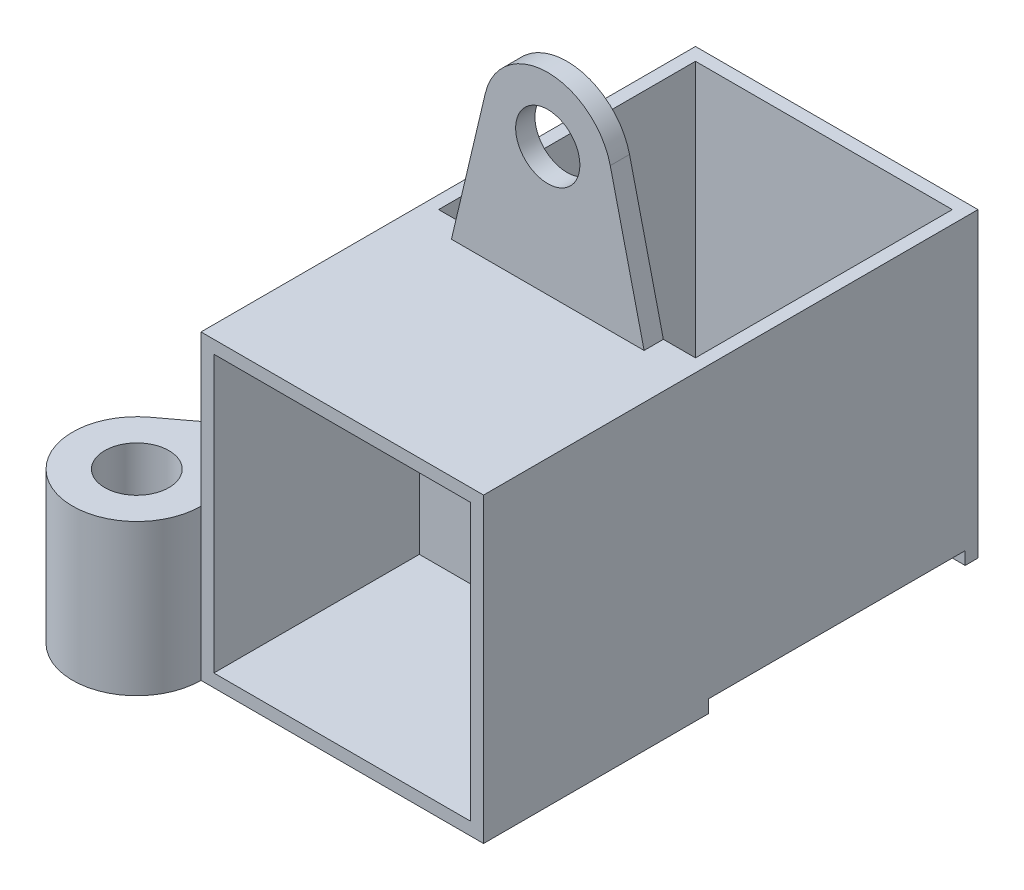
ISO-10303-21;
HEADER;
FILE_DESCRIPTION(('STEP AP214'),'2;1');
FILE_NAME('part.step','',(''),(''),'','','');
FILE_SCHEMA(('AUTOMOTIVE_DESIGN { 1 0 10303 214 1 1 1 1 }'));
ENDSEC;
DATA;
#1=APPLICATION_CONTEXT('core data for automotive mechanical design processes');
#2=APPLICATION_PROTOCOL_DEFINITION('international standard','automotive_design',2000,#1);
#3=PRODUCT_CONTEXT('',#1,'mechanical');
#4=PRODUCT('Part','Part','',(#3));
#5=PRODUCT_RELATED_PRODUCT_CATEGORY('part','',(#4));
#6=PRODUCT_DEFINITION_FORMATION('','',#4);
#7=PRODUCT_DEFINITION_CONTEXT('part definition',#1,'design');
#8=PRODUCT_DEFINITION('design','',#6,#7);
#9=PRODUCT_DEFINITION_SHAPE('','',#8);
#10=(LENGTH_UNIT() NAMED_UNIT(*) SI_UNIT(.MILLI.,.METRE.));
#11=(NAMED_UNIT(*) PLANE_ANGLE_UNIT() SI_UNIT($,.RADIAN.));
#12=(NAMED_UNIT(*) SI_UNIT($,.STERADIAN.) SOLID_ANGLE_UNIT());
#13=UNCERTAINTY_MEASURE_WITH_UNIT(LENGTH_MEASURE(1.E-05),#10,'distance_accuracy_value','');
#14=(GEOMETRIC_REPRESENTATION_CONTEXT(3) GLOBAL_UNCERTAINTY_ASSIGNED_CONTEXT((#13)) GLOBAL_UNIT_ASSIGNED_CONTEXT((#10,
#11,#12)) REPRESENTATION_CONTEXT('',''));
#15=CARTESIAN_POINT('',(0.,0.,0.));
#16=DIRECTION('',(0.,0.,1.));
#17=DIRECTION('',(1.,0.,0.));
#18=AXIS2_PLACEMENT_3D('',#15,#16,#17);
#19=CARTESIAN_POINT('',(-32.,-43.5,32.));
#20=DIRECTION('',(0.,-1.,0.));
#21=DIRECTION('',(0.,0.,-1.));
#22=AXIS2_PLACEMENT_3D('',#19,#20,#21);
#23=CYLINDRICAL_SURFACE('',#22,10.);
#24=CARTESIAN_POINT('',(-32.,-67.,32.));
#25=DIRECTION('',(0.,1.,0.));
#26=DIRECTION('',(0.,0.,1.));
#27=AXIS2_PLACEMENT_3D('',#24,#25,#26);
#28=CIRCLE('',#27,10.);
#29=CARTESIAN_POINT('',(-38.,-67.,24.));
#30=VERTEX_POINT('',#29);
#31=CARTESIAN_POINT('',(-22.,-67.,32.));
#32=VERTEX_POINT('',#31);
#33=EDGE_CURVE('E129',#30,#32,#28,.T.);
#34=ORIENTED_EDGE('',*,*,#33,.T.);
#35=DIRECTION('',(0.,-1.,0.));
#36=VECTOR('',#35,1.);
#37=CARTESIAN_POINT('',(-22.,-43.5,32.));
#38=LINE('',#37,#36);
#39=CARTESIAN_POINT('',(-22.,-43.5,32.));
#40=VERTEX_POINT('',#39);
#41=EDGE_CURVE('E91',#40,#32,#38,.T.);
#42=ORIENTED_EDGE('',*,*,#41,.F.);
#43=CARTESIAN_POINT('',(-32.,-43.5,32.));
#44=DIRECTION('',(0.,1.,0.));
#45=DIRECTION('',(0.,0.,1.));
#46=AXIS2_PLACEMENT_3D('',#43,#44,#45);
#47=CIRCLE('',#46,10.);
#48=CARTESIAN_POINT('',(-38.,-43.5,24.));
#49=VERTEX_POINT('',#48);
#50=EDGE_CURVE('E122',#49,#40,#47,.T.);
#51=ORIENTED_EDGE('',*,*,#50,.F.);
#52=DIRECTION('',(0.,-1.,0.));
#53=VECTOR('',#52,1.);
#54=CARTESIAN_POINT('',(-38.,-43.5,24.));
#55=LINE('',#54,#53);
#56=EDGE_CURVE('E13',#49,#30,#55,.T.);
#57=ORIENTED_EDGE('',*,*,#56,.T.);
#58=EDGE_LOOP('',(#34,#42,#51,#57));
#59=FACE_BOUND('',#58,.T.);
#60=ADVANCED_FACE('F81',(#59),#23,.T.);
#61=CARTESIAN_POINT('',(-38.6618069237234,-43.5,24.4963551927926));
#62=DIRECTION('',(-0.6,0.,-0.8));
#63=DIRECTION('',(-0.8,0.,0.6));
#64=AXIS2_PLACEMENT_3D('',#61,#62,#63);
#65=PLANE('',#64);
#66=DIRECTION('',(0.8,0.,-0.6));
#67=VECTOR('',#66,1.);
#68=CARTESIAN_POINT('',(-38.6618069237234,-67.,24.4963551927926));
#69=LINE('',#68,#67);
#70=CARTESIAN_POINT('',(-22.,-67.,12.));
#71=VERTEX_POINT('',#70);
#72=EDGE_CURVE('E137',#30,#71,#69,.T.);
#73=ORIENTED_EDGE('',*,*,#72,.F.);
#74=ORIENTED_EDGE('',*,*,#56,.F.);
#75=DIRECTION('',(0.8,0.,-0.6));
#76=VECTOR('',#75,1.);
#77=CARTESIAN_POINT('',(-38.6618069237234,-43.5,24.4963551927926));
#78=LINE('',#77,#76);
#79=CARTESIAN_POINT('',(-22.,-43.5,12.));
#80=VERTEX_POINT('',#79);
#81=EDGE_CURVE('E127',#49,#80,#78,.T.);
#82=ORIENTED_EDGE('',*,*,#81,.T.);
#83=DIRECTION('',(0.,-1.,0.));
#84=VECTOR('',#83,1.);
#85=CARTESIAN_POINT('',(-22.,-43.5,12.));
#86=LINE('',#85,#84);
#87=EDGE_CURVE('E85',#80,#71,#86,.T.);
#88=ORIENTED_EDGE('',*,*,#87,.T.);
#89=EDGE_LOOP('',(#73,#74,#82,#88));
#90=FACE_BOUND('',#89,.T.);
#91=ADVANCED_FACE('F83',(#90),#65,.T.);
#92=CARTESIAN_POINT('',(-22.,-43.5,76.0454310910905));
#93=DIRECTION('',(1.,0.,0.));
#94=DIRECTION('',(0.,0.,-1.));
#95=AXIS2_PLACEMENT_3D('',#92,#93,#94);
#96=PLANE('',#95);
#97=DIRECTION('',(0.,0.,1.));
#98=VECTOR('',#97,1.);
#99=CARTESIAN_POINT('',(-22.,-67.,76.0454310910905));
#100=LINE('',#99,#98);
#101=EDGE_CURVE('E120',#71,#32,#100,.T.);
#102=ORIENTED_EDGE('',*,*,#101,.F.);
#103=ORIENTED_EDGE('',*,*,#87,.F.);
#104=DIRECTION('',(0.,0.,1.));
#105=VECTOR('',#104,1.);
#106=CARTESIAN_POINT('',(-22.,-43.5,76.0454310910905));
#107=LINE('',#106,#105);
#108=EDGE_CURVE('E118',#80,#40,#107,.T.);
#109=ORIENTED_EDGE('',*,*,#108,.T.);
#110=ORIENTED_EDGE('',*,*,#41,.T.);
#111=EDGE_LOOP('',(#102,#103,#109,#110));
#112=FACE_BOUND('',#111,.T.);
#113=ADVANCED_FACE('F117',(#112),#96,.T.);
#114=CARTESIAN_POINT('',(-32.,-67.,32.));
#115=DIRECTION('',(0.,1.,0.));
#116=DIRECTION('',(0.,0.,1.));
#117=AXIS2_PLACEMENT_3D('',#114,#115,#116);
#118=PLANE('',#117);
#119=CARTESIAN_POINT('',(-32.,-67.,32.));
#120=DIRECTION('',(0.,1.,0.));
#121=DIRECTION('',(0.,0.,1.));
#122=AXIS2_PLACEMENT_3D('',#119,#120,#121);
#123=CIRCLE('',#122,5.);
#124=CARTESIAN_POINT('',(-32.,-67.,37.));
#125=VERTEX_POINT('',#124);
#126=EDGE_CURVE('E139',#125,#125,#123,.T.);
#127=ORIENTED_EDGE('',*,*,#126,.T.);
#128=EDGE_LOOP('',(#127));
#129=FACE_BOUND('',#128,.T.);
#130=ORIENTED_EDGE('',*,*,#101,.T.);
#131=ORIENTED_EDGE('',*,*,#33,.F.);
#132=ORIENTED_EDGE('',*,*,#72,.T.);
#133=EDGE_LOOP('',(#130,#131,#132));
#134=FACE_BOUND('',#133,.T.);
#135=ADVANCED_FACE('F141',(#129,#134),#118,.F.);
#136=CARTESIAN_POINT('',(-32.,-43.5,32.));
#137=DIRECTION('',(0.,1.,0.));
#138=DIRECTION('',(0.,0.,1.));
#139=AXIS2_PLACEMENT_3D('',#136,#137,#138);
#140=PLANE('',#139);
#141=CARTESIAN_POINT('',(-32.,-43.5,32.));
#142=DIRECTION('',(0.,1.,0.));
#143=DIRECTION('',(0.,0.,1.));
#144=AXIS2_PLACEMENT_3D('',#141,#142,#143);
#145=CIRCLE('',#144,5.);
#146=CARTESIAN_POINT('',(-32.,-43.5,37.));
#147=VERTEX_POINT('',#146);
#148=EDGE_CURVE('E133',#147,#147,#145,.T.);
#149=ORIENTED_EDGE('',*,*,#148,.F.);
#150=EDGE_LOOP('',(#149));
#151=FACE_BOUND('',#150,.T.);
#152=ORIENTED_EDGE('',*,*,#81,.F.);
#153=ORIENTED_EDGE('',*,*,#50,.T.);
#154=ORIENTED_EDGE('',*,*,#108,.F.);
#155=EDGE_LOOP('',(#152,#153,#154));
#156=FACE_BOUND('',#155,.T.);
#157=ADVANCED_FACE('F126',(#151,#156),#140,.T.);
#158=CARTESIAN_POINT('',(-32.,-67.,32.));
#159=DIRECTION('',(0.,1.,0.));
#160=DIRECTION('',(0.,0.,1.));
#161=AXIS2_PLACEMENT_3D('',#158,#159,#160);
#162=CYLINDRICAL_SURFACE('',#161,5.);
#163=ORIENTED_EDGE('',*,*,#126,.F.);
#164=EDGE_LOOP('',(#163));
#165=FACE_BOUND('',#164,.T.);
#166=ORIENTED_EDGE('',*,*,#148,.T.);
#167=EDGE_LOOP('',(#166));
#168=FACE_BOUND('',#167,.T.);
#169=ADVANCED_FACE('F157',(#165,#168),#162,.F.);
#170=CLOSED_SHELL('',(#60,#91,#113,#135,#157,#169));
#171=MANIFOLD_SOLID_BREP('B2',#170);
#172=CARTESIAN_POINT('',(0.,0.,0.));
#173=DIRECTION('',(0.,0.,1.));
#174=DIRECTION('',(1.,0.,0.));
#175=AXIS2_PLACEMENT_3D('',#172,#173,#174);
#176=PLANE('',#175);
#177=DIRECTION('',(0.,1.,0.));
#178=VECTOR('',#177,1.);
#179=CARTESIAN_POINT('',(20.,0.,0.));
#180=LINE('',#179,#178);
#181=CARTESIAN_POINT('',(20.,-65.,0.));
#182=VERTEX_POINT('',#181);
#183=CARTESIAN_POINT('',(20.,-22.,0.));
#184=VERTEX_POINT('',#183);
#185=EDGE_CURVE('E511',#182,#184,#180,.T.);
#186=ORIENTED_EDGE('',*,*,#185,.T.);
#187=DIRECTION('',(-1.,0.,0.));
#188=VECTOR('',#187,1.);
#189=CARTESIAN_POINT('',(0.,-22.,0.));
#190=LINE('',#189,#188);
#191=CARTESIAN_POINT('',(-20.,-22.,0.));
#192=VERTEX_POINT('',#191);
#193=EDGE_CURVE('E251',#184,#192,#190,.T.);
#194=ORIENTED_EDGE('',*,*,#193,.T.);
#195=DIRECTION('',(0.,1.,0.));
#196=VECTOR('',#195,1.);
#197=CARTESIAN_POINT('',(-20.,0.,0.));
#198=LINE('',#197,#196);
#199=CARTESIAN_POINT('',(-20.,-65.,0.));
#200=VERTEX_POINT('',#199);
#201=EDGE_CURVE('E507',#200,#192,#198,.T.);
#202=ORIENTED_EDGE('',*,*,#201,.F.);
#203=DIRECTION('',(1.,0.,0.));
#204=VECTOR('',#203,1.);
#205=CARTESIAN_POINT('',(0.,-65.,0.));
#206=LINE('',#205,#204);
#207=EDGE_CURVE('E509',#200,#182,#206,.T.);
#208=ORIENTED_EDGE('',*,*,#207,.T.);
#209=EDGE_LOOP('',(#186,#194,#202,#208));
#210=FACE_BOUND('',#209,.T.);
#211=ADVANCED_FACE('F233',(#210),#176,.T.);
#212=CARTESIAN_POINT('',(-20.,0.,32.));
#213=DIRECTION('',(-1.,0.,0.));
#214=DIRECTION('',(0.,0.,1.));
#215=AXIS2_PLACEMENT_3D('',#212,#213,#214);
#216=PLANE('',#215);
#217=DIRECTION('',(0.,0.,-1.));
#218=VECTOR('',#217,1.);
#219=CARTESIAN_POINT('',(-20.,-22.,32.));
#220=LINE('',#219,#218);
#221=CARTESIAN_POINT('',(-20.,-22.,32.));
#222=VERTEX_POINT('',#221);
#223=EDGE_CURVE('E258',#222,#192,#220,.T.);
#224=ORIENTED_EDGE('',*,*,#223,.F.);
#225=DIRECTION('',(0.,1.,0.));
#226=VECTOR('',#225,1.);
#227=CARTESIAN_POINT('',(-20.,0.,32.));
#228=LINE('',#227,#226);
#229=CARTESIAN_POINT('',(-20.,-65.,32.));
#230=VERTEX_POINT('',#229);
#231=EDGE_CURVE('E465',#230,#222,#228,.T.);
#232=ORIENTED_EDGE('',*,*,#231,.F.);
#233=DIRECTION('',(0.,0.,-1.));
#234=VECTOR('',#233,1.);
#235=CARTESIAN_POINT('',(-20.,-65.,32.));
#236=LINE('',#235,#234);
#237=EDGE_CURVE('E468',#230,#200,#236,.T.);
#238=ORIENTED_EDGE('',*,*,#237,.T.);
#239=ORIENTED_EDGE('',*,*,#201,.T.);
#240=EDGE_LOOP('',(#224,#232,#238,#239));
#241=FACE_BOUND('',#240,.T.);
#242=ADVANCED_FACE('F562',(#241),#216,.F.);
#243=CARTESIAN_POINT('',(20.,0.,-43.));
#244=DIRECTION('',(1.,0.,0.));
#245=DIRECTION('',(0.,0.,-1.));
#246=AXIS2_PLACEMENT_3D('',#243,#244,#245);
#247=PLANE('',#246);
#248=DIRECTION('',(0.,0.,1.));
#249=VECTOR('',#248,1.);
#250=CARTESIAN_POINT('',(20.,-22.,-43.));
#251=LINE('',#250,#249);
#252=CARTESIAN_POINT('',(20.,-22.,32.));
#253=VERTEX_POINT('',#252);
#254=EDGE_CURVE('E546',#184,#253,#251,.T.);
#255=ORIENTED_EDGE('',*,*,#254,.F.);
#256=ORIENTED_EDGE('',*,*,#185,.F.);
#257=DIRECTION('',(0.,0.,1.));
#258=VECTOR('',#257,1.);
#259=CARTESIAN_POINT('',(20.,-65.,-43.));
#260=LINE('',#259,#258);
#261=CARTESIAN_POINT('',(20.,-65.,32.));
#262=VERTEX_POINT('',#261);
#263=EDGE_CURVE('E450',#182,#262,#260,.T.);
#264=ORIENTED_EDGE('',*,*,#263,.T.);
#265=DIRECTION('',(0.,1.,0.));
#266=VECTOR('',#265,1.);
#267=CARTESIAN_POINT('',(20.,0.,32.));
#268=LINE('',#267,#266);
#269=EDGE_CURVE('E437',#262,#253,#268,.T.);
#270=ORIENTED_EDGE('',*,*,#269,.T.);
#271=EDGE_LOOP('',(#255,#256,#264,#270));
#272=FACE_BOUND('',#271,.T.);
#273=ADVANCED_FACE('F569',(#272),#247,.F.);
#274=CARTESIAN_POINT('',(0.,-65.,-3.));
#275=DIRECTION('',(0.,-1.,0.));
#276=DIRECTION('',(1.,0.,0.));
#277=AXIS2_PLACEMENT_3D('',#274,#275,#276);
#278=PLANE('',#277);
#279=DIRECTION('',(1.,0.,0.));
#280=VECTOR('',#279,1.);
#281=CARTESIAN_POINT('',(-4.51028103753967E-13,-64.9999999999999,-3.));
#282=LINE('',#281,#280);
#283=CARTESIAN_POINT('',(-22.,-65.,-3.));
#284=VERTEX_POINT('',#283);
#285=CARTESIAN_POINT('',(-20.,-65.,-3.));
#286=VERTEX_POINT('',#285);
#287=EDGE_CURVE('E244',#284,#286,#282,.T.);
#288=ORIENTED_EDGE('',*,*,#287,.F.);
#289=DIRECTION('',(0.,0.,-1.));
#290=VECTOR('',#289,1.);
#291=CARTESIAN_POINT('',(-22.,-65.,32.));
#292=LINE('',#291,#290);
#293=CARTESIAN_POINT('',(-22.,-65.,-43.));
#294=VERTEX_POINT('',#293);
#295=EDGE_CURVE('E467',#284,#294,#292,.T.);
#296=ORIENTED_EDGE('',*,*,#295,.T.);
#297=DIRECTION('',(-1.,0.,0.));
#298=VECTOR('',#297,1.);
#299=CARTESIAN_POINT('',(0.,-65.,-43.));
#300=LINE('',#299,#298);
#301=CARTESIAN_POINT('',(-20.,-65.,-43.));
#302=VERTEX_POINT('',#301);
#303=EDGE_CURVE('E449',#302,#294,#300,.T.);
#304=ORIENTED_EDGE('',*,*,#303,.F.);
#305=EDGE_CURVE('E471',#286,#302,#236,.T.);
#306=ORIENTED_EDGE('',*,*,#305,.F.);
#307=EDGE_LOOP('',(#288,#296,#304,#306));
#308=FACE_BOUND('',#307,.T.);
#309=ADVANCED_FACE('F571',(#308),#278,.T.);
#310=CARTESIAN_POINT('',(0.,0.,-3.));
#311=DIRECTION('',(0.,0.,1.));
#312=DIRECTION('',(1.,0.,0.));
#313=AXIS2_PLACEMENT_3D('',#310,#311,#312);
#314=CYLINDRICAL_SURFACE('',#313,10.);
#315=CARTESIAN_POINT('',(0.,0.,0.));
#316=DIRECTION('',(0.,0.,1.));
#317=DIRECTION('',(1.,0.,0.));
#318=AXIS2_PLACEMENT_3D('',#315,#316,#317);
#319=CIRCLE('',#318,10.);
#320=CARTESIAN_POINT('',(9.73212111192934,2.29909083394701,0.));
#321=VERTEX_POINT('',#320);
#322=CARTESIAN_POINT('',(-9.73212111192934,2.29909083394701,0.));
#323=VERTEX_POINT('',#322);
#324=EDGE_CURVE('E501',#321,#323,#319,.T.);
#325=ORIENTED_EDGE('',*,*,#324,.F.);
#326=DIRECTION('',(0.,0.,1.));
#327=VECTOR('',#326,1.);
#328=CARTESIAN_POINT('',(9.73212111192934,2.29909083394701,-3.));
#329=LINE('',#328,#327);
#330=CARTESIAN_POINT('',(9.73212111192934,2.29909083394701,-3.));
#331=VERTEX_POINT('',#330);
#332=EDGE_CURVE('E242',#331,#321,#329,.T.);
#333=ORIENTED_EDGE('',*,*,#332,.F.);
#334=CARTESIAN_POINT('',(0.,0.,-3.));
#335=DIRECTION('',(0.,0.,1.));
#336=DIRECTION('',(1.,0.,0.));
#337=AXIS2_PLACEMENT_3D('',#334,#335,#336);
#338=CIRCLE('',#337,10.);
#339=CARTESIAN_POINT('',(-9.73212111192934,2.29909083394701,-3.));
#340=VERTEX_POINT('',#339);
#341=EDGE_CURVE('E482',#331,#340,#338,.T.);
#342=ORIENTED_EDGE('',*,*,#341,.T.);
#343=DIRECTION('',(0.,0.,1.));
#344=VECTOR('',#343,1.);
#345=CARTESIAN_POINT('',(-9.73212111192934,2.29909083394701,-3.));
#346=LINE('',#345,#344);
#347=EDGE_CURVE('E237',#340,#323,#346,.T.);
#348=ORIENTED_EDGE('',*,*,#347,.T.);
#349=EDGE_LOOP('',(#325,#333,#342,#348));
#350=FACE_BOUND('',#349,.T.);
#351=ADVANCED_FACE('F524',(#350),#314,.T.);
#352=CARTESIAN_POINT('',(9.73212111192933,2.29909083394701,-3.));
#353=DIRECTION('',(-0.973212111192934,-0.229909083394701,0.));
#354=DIRECTION('',(0.229909083394701,-0.973212111192934,0.));
#355=AXIS2_PLACEMENT_3D('',#352,#353,#354);
#356=PLANE('',#355);
#357=DIRECTION('',(0.229909083394701,-0.973212111192934,0.));
#358=VECTOR('',#357,1.);
#359=CARTESIAN_POINT('',(9.73212111192933,2.29909083394701,0.));
#360=LINE('',#359,#358);
#361=CARTESIAN_POINT('',(15.,-20.,0.));
#362=VERTEX_POINT('',#361);
#363=EDGE_CURVE('E483',#321,#362,#360,.T.);
#364=ORIENTED_EDGE('',*,*,#363,.T.);
#365=DIRECTION('',(0.,0.,1.));
#366=VECTOR('',#365,1.);
#367=CARTESIAN_POINT('',(15.,-20.,-3.));
#368=LINE('',#367,#366);
#369=CARTESIAN_POINT('',(15.,-20.,-3.));
#370=VERTEX_POINT('',#369);
#371=EDGE_CURVE('E516',#370,#362,#368,.T.);
#372=ORIENTED_EDGE('',*,*,#371,.F.);
#373=DIRECTION('',(0.229909083394701,-0.973212111192934,0.));
#374=VECTOR('',#373,1.);
#375=CARTESIAN_POINT('',(9.73212111192933,2.29909083394701,-3.));
#376=LINE('',#375,#374);
#377=EDGE_CURVE('E496',#331,#370,#376,.T.);
#378=ORIENTED_EDGE('',*,*,#377,.F.);
#379=ORIENTED_EDGE('',*,*,#332,.T.);
#380=EDGE_LOOP('',(#364,#372,#378,#379));
#381=FACE_BOUND('',#380,.T.);
#382=ADVANCED_FACE('F536',(#381),#356,.F.);
#383=CARTESIAN_POINT('',(0.,-20.,-3.));
#384=DIRECTION('',(0.,-1.,0.));
#385=DIRECTION('',(1.,0.,0.));
#386=AXIS2_PLACEMENT_3D('',#383,#384,#385);
#387=PLANE('',#386);
#388=DIRECTION('',(1.,0.,0.));
#389=VECTOR('',#388,1.);
#390=CARTESIAN_POINT('',(0.,-20.,-3.));
#391=LINE('',#390,#389);
#392=CARTESIAN_POINT('',(-20.,-20.,-3.));
#393=VERTEX_POINT('',#392);
#394=CARTESIAN_POINT('',(-15.,-20.,-3.));
#395=VERTEX_POINT('',#394);
#396=EDGE_CURVE('E489',#393,#395,#391,.T.);
#397=ORIENTED_EDGE('',*,*,#396,.F.);
#398=DIRECTION('',(0.,0.,-1.));
#399=VECTOR('',#398,1.);
#400=CARTESIAN_POINT('',(-20.,-20.,32.));
#401=LINE('',#400,#399);
#402=CARTESIAN_POINT('',(-20.,-20.,-43.));
#403=VERTEX_POINT('',#402);
#404=EDGE_CURVE('E472',#393,#403,#401,.T.);
#405=ORIENTED_EDGE('',*,*,#404,.T.);
#406=DIRECTION('',(1.,0.,0.));
#407=VECTOR('',#406,1.);
#408=CARTESIAN_POINT('',(0.,-20.,-43.));
#409=LINE('',#408,#407);
#410=CARTESIAN_POINT('',(20.,-20.,-43.));
#411=VERTEX_POINT('',#410);
#412=EDGE_CURVE('E387',#403,#411,#409,.T.);
#413=ORIENTED_EDGE('',*,*,#412,.T.);
#414=DIRECTION('',(0.,0.,1.));
#415=VECTOR('',#414,1.);
#416=CARTESIAN_POINT('',(20.,-20.,-43.));
#417=LINE('',#416,#415);
#418=CARTESIAN_POINT('',(20.,-20.,-3.));
#419=VERTEX_POINT('',#418);
#420=EDGE_CURVE('E451',#411,#419,#417,.T.);
#421=ORIENTED_EDGE('',*,*,#420,.T.);
#422=EDGE_CURVE('E492',#370,#419,#391,.T.);
#423=ORIENTED_EDGE('',*,*,#422,.F.);
#424=ORIENTED_EDGE('',*,*,#371,.T.);
#425=DIRECTION('',(-1.,0.,0.));
#426=VECTOR('',#425,1.);
#427=CARTESIAN_POINT('',(0.,-20.,0.));
#428=LINE('',#427,#426);
#429=CARTESIAN_POINT('',(-15.,-20.,0.));
#430=VERTEX_POINT('',#429);
#431=EDGE_CURVE('E533',#362,#430,#428,.T.);
#432=ORIENTED_EDGE('',*,*,#431,.T.);
#433=DIRECTION('',(0.,0.,1.));
#434=VECTOR('',#433,1.);
#435=CARTESIAN_POINT('',(-15.,-20.,-3.));
#436=LINE('',#435,#434);
#437=EDGE_CURVE('E518',#395,#430,#436,.T.);
#438=ORIENTED_EDGE('',*,*,#437,.F.);
#439=EDGE_LOOP('',(#397,#405,#413,#421,#423,#424,#432,#438));
#440=FACE_BOUND('',#439,.T.);
#441=DIRECTION('',(1.,0.,0.));
#442=VECTOR('',#441,1.);
#443=CARTESIAN_POINT('',(0.,-20.,-45.));
#444=LINE('',#443,#442);
#445=CARTESIAN_POINT('',(-22.,-20.,-45.));
#446=VERTEX_POINT('',#445);
#447=CARTESIAN_POINT('',(22.,-20.,-45.));
#448=VERTEX_POINT('',#447);
#449=EDGE_CURVE('E384',#446,#448,#444,.T.);
#450=ORIENTED_EDGE('',*,*,#449,.F.);
#451=DIRECTION('',(0.,0.,-1.));
#452=VECTOR('',#451,1.);
#453=CARTESIAN_POINT('',(-22.,-20.,32.));
#454=LINE('',#453,#452);
#455=CARTESIAN_POINT('',(-22.,-20.,32.));
#456=VERTEX_POINT('',#455);
#457=EDGE_CURVE('E475',#456,#446,#454,.T.);
#458=ORIENTED_EDGE('',*,*,#457,.F.);
#459=DIRECTION('',(-1.,0.,0.));
#460=VECTOR('',#459,1.);
#461=CARTESIAN_POINT('',(0.,-20.,32.));
#462=LINE('',#461,#460);
#463=CARTESIAN_POINT('',(22.,-20.,32.));
#464=VERTEX_POINT('',#463);
#465=EDGE_CURVE('E463',#464,#456,#462,.T.);
#466=ORIENTED_EDGE('',*,*,#465,.F.);
#467=DIRECTION('',(0.,0.,1.));
#468=VECTOR('',#467,1.);
#469=CARTESIAN_POINT('',(22.,-20.,-43.));
#470=LINE('',#469,#468);
#471=EDGE_CURVE('E454',#448,#464,#470,.T.);
#472=ORIENTED_EDGE('',*,*,#471,.F.);
#473=EDGE_LOOP('',(#450,#458,#466,#472));
#474=FACE_BOUND('',#473,.T.);
#475=ADVANCED_FACE('F544',(#440,#474),#387,.F.);
#476=CARTESIAN_POINT('',(20.,-65.,-3.));
#477=VERTEX_POINT('',#476);
#478=CARTESIAN_POINT('',(22.,-65.,-3.));
#479=VERTEX_POINT('',#478);
#480=EDGE_CURVE('E79',#477,#479,#282,.T.);
#481=ORIENTED_EDGE('',*,*,#480,.F.);
#482=CARTESIAN_POINT('',(20.,-65.,-43.));
#483=VERTEX_POINT('',#482);
#484=EDGE_CURVE('E446',#483,#477,#260,.T.);
#485=ORIENTED_EDGE('',*,*,#484,.F.);
#486=DIRECTION('',(1.,0.,0.));
#487=VECTOR('',#486,1.);
#488=CARTESIAN_POINT('',(-4.51028103753967E-13,-64.9999999999999,-43.));
#489=LINE('',#488,#487);
#490=CARTESIAN_POINT('',(22.,-65.,-43.));
#491=VERTEX_POINT('',#490);
#492=EDGE_CURVE('E439',#483,#491,#489,.T.);
#493=ORIENTED_EDGE('',*,*,#492,.T.);
#494=DIRECTION('',(0.,0.,1.));
#495=VECTOR('',#494,1.);
#496=CARTESIAN_POINT('',(22.,-65.,-43.));
#497=LINE('',#496,#495);
#498=EDGE_CURVE('E445',#491,#479,#497,.T.);
#499=ORIENTED_EDGE('',*,*,#498,.T.);
#500=EDGE_LOOP('',(#481,#485,#493,#499));
#501=FACE_BOUND('',#500,.T.);
#502=ADVANCED_FACE('F580',(#501),#278,.T.);
#503=CARTESIAN_POINT('',(0.,0.,-3.));
#504=DIRECTION('',(0.,0.,1.));
#505=DIRECTION('',(1.,0.,0.));
#506=AXIS2_PLACEMENT_3D('',#503,#504,#505);
#507=CYLINDRICAL_SURFACE('',#506,5.);
#508=CARTESIAN_POINT('',(0.,0.,-3.));
#509=DIRECTION('',(0.,0.,1.));
#510=DIRECTION('',(1.,0.,0.));
#511=AXIS2_PLACEMENT_3D('',#508,#509,#510);
#512=CIRCLE('',#511,5.);
#513=CARTESIAN_POINT('',(5.,0.,-3.));
#514=VERTEX_POINT('',#513);
#515=EDGE_CURVE('E479',#514,#514,#512,.T.);
#516=ORIENTED_EDGE('',*,*,#515,.F.);
#517=EDGE_LOOP('',(#516));
#518=FACE_BOUND('',#517,.T.);
#519=CARTESIAN_POINT('',(0.,0.,0.));
#520=DIRECTION('',(0.,0.,1.));
#521=DIRECTION('',(1.,0.,0.));
#522=AXIS2_PLACEMENT_3D('',#519,#520,#521);
#523=CIRCLE('',#522,5.);
#524=CARTESIAN_POINT('',(5.,0.,0.));
#525=VERTEX_POINT('',#524);
#526=EDGE_CURVE('E470',#525,#525,#523,.T.);
#527=ORIENTED_EDGE('',*,*,#526,.T.);
#528=EDGE_LOOP('',(#527));
#529=FACE_BOUND('',#528,.T.);
#530=ADVANCED_FACE('F235',(#518,#529),#507,.F.);
#531=CARTESIAN_POINT('',(-9.73212111192934,2.29909083394701,-3.));
#532=DIRECTION('',(-0.973212111192934,0.229909083394701,0.));
#533=DIRECTION('',(-0.229909083394701,-0.973212111192934,0.));
#534=AXIS2_PLACEMENT_3D('',#531,#532,#533);
#535=PLANE('',#534);
#536=DIRECTION('',(-0.229909083394701,-0.973212111192934,0.));
#537=VECTOR('',#536,1.);
#538=CARTESIAN_POINT('',(-9.73212111192934,2.29909083394701,0.));
#539=LINE('',#538,#537);
#540=EDGE_CURVE('E504',#323,#430,#539,.T.);
#541=ORIENTED_EDGE('',*,*,#540,.F.);
#542=ORIENTED_EDGE('',*,*,#347,.F.);
#543=DIRECTION('',(-0.229909083394701,-0.973212111192934,0.));
#544=VECTOR('',#543,1.);
#545=CARTESIAN_POINT('',(-9.73212111192934,2.29909083394701,-3.));
#546=LINE('',#545,#544);
#547=EDGE_CURVE('E486',#340,#395,#546,.T.);
#548=ORIENTED_EDGE('',*,*,#547,.T.);
#549=ORIENTED_EDGE('',*,*,#437,.T.);
#550=EDGE_LOOP('',(#541,#542,#548,#549));
#551=FACE_BOUND('',#550,.T.);
#552=ADVANCED_FACE('F527',(#551),#535,.T.);
#553=CARTESIAN_POINT('',(0.,0.,-3.));
#554=DIRECTION('',(0.,0.,1.));
#555=DIRECTION('',(1.,0.,0.));
#556=AXIS2_PLACEMENT_3D('',#553,#554,#555);
#557=PLANE('',#556);
#558=ORIENTED_EDGE('',*,*,#515,.T.);
#559=EDGE_LOOP('',(#558));
#560=FACE_BOUND('',#559,.T.);
#561=ORIENTED_EDGE('',*,*,#377,.T.);
#562=ORIENTED_EDGE('',*,*,#422,.T.);
#563=DIRECTION('',(0.,1.,0.));
#564=VECTOR('',#563,1.);
#565=CARTESIAN_POINT('',(20.,0.,-3.));
#566=LINE('',#565,#564);
#567=EDGE_CURVE('E494',#477,#419,#566,.T.);
#568=ORIENTED_EDGE('',*,*,#567,.F.);
#569=ORIENTED_EDGE('',*,*,#480,.T.);
#570=DIRECTION('',(0.,-1.,0.));
#571=VECTOR('',#570,1.);
#572=CARTESIAN_POINT('',(21.9999999999998,0.,-3.));
#573=LINE('',#572,#571);
#574=CARTESIAN_POINT('',(22.,-67.,-3.));
#575=VERTEX_POINT('',#574);
#576=EDGE_CURVE('E417',#479,#575,#573,.T.);
#577=ORIENTED_EDGE('',*,*,#576,.T.);
#578=DIRECTION('',(1.,0.,0.));
#579=VECTOR('',#578,1.);
#580=CARTESIAN_POINT('',(0.,-67.,-3.));
#581=LINE('',#580,#579);
#582=CARTESIAN_POINT('',(-22.,-67.,-3.));
#583=VERTEX_POINT('',#582);
#584=EDGE_CURVE('E421',#583,#575,#581,.T.);
#585=ORIENTED_EDGE('',*,*,#584,.F.);
#586=DIRECTION('',(0.,-1.,0.));
#587=VECTOR('',#586,1.);
#588=CARTESIAN_POINT('',(-22.,0.,-3.));
#589=LINE('',#588,#587);
#590=EDGE_CURVE('E424',#284,#583,#589,.T.);
#591=ORIENTED_EDGE('',*,*,#590,.F.);
#592=ORIENTED_EDGE('',*,*,#287,.T.);
#593=DIRECTION('',(0.,1.,0.));
#594=VECTOR('',#593,1.);
#595=CARTESIAN_POINT('',(-20.,0.,-3.));
#596=LINE('',#595,#594);
#597=EDGE_CURVE('E491',#286,#393,#596,.T.);
#598=ORIENTED_EDGE('',*,*,#597,.T.);
#599=ORIENTED_EDGE('',*,*,#396,.T.);
#600=ORIENTED_EDGE('',*,*,#547,.F.);
#601=ORIENTED_EDGE('',*,*,#341,.F.);
#602=EDGE_LOOP('',(#561,#562,#568,#569,#577,#585,#591,#592,#598,#599,#600,#601));
#603=FACE_BOUND('',#602,.T.);
#604=ADVANCED_FACE('F540',(#560,#603),#557,.F.);
#605=ORIENTED_EDGE('',*,*,#431,.F.);
#606=ORIENTED_EDGE('',*,*,#363,.F.);
#607=ORIENTED_EDGE('',*,*,#324,.T.);
#608=ORIENTED_EDGE('',*,*,#540,.T.);
#609=EDGE_LOOP('',(#605,#606,#607,#608));
#610=FACE_BOUND('',#609,.T.);
#611=ORIENTED_EDGE('',*,*,#526,.F.);
#612=EDGE_LOOP('',(#611));
#613=FACE_BOUND('',#612,.T.);
#614=ADVANCED_FACE('F531',(#610,#613),#176,.T.);
#615=ORIENTED_EDGE('',*,*,#597,.F.);
#616=ORIENTED_EDGE('',*,*,#305,.T.);
#617=DIRECTION('',(0.,1.,0.));
#618=VECTOR('',#617,1.);
#619=CARTESIAN_POINT('',(-20.,0.,-43.));
#620=LINE('',#619,#618);
#621=EDGE_CURVE('E458',#302,#403,#620,.T.);
#622=ORIENTED_EDGE('',*,*,#621,.T.);
#623=ORIENTED_EDGE('',*,*,#404,.F.);
#624=EDGE_LOOP('',(#615,#616,#622,#623));
#625=FACE_BOUND('',#624,.T.);
#626=ADVANCED_FACE('F582',(#625),#216,.F.);
#627=CARTESIAN_POINT('',(-22.,0.,32.));
#628=DIRECTION('',(1.,0.,0.));
#629=DIRECTION('',(0.,1.,0.));
#630=AXIS2_PLACEMENT_3D('',#627,#628,#629);
#631=PLANE('',#630);
#632=DIRECTION('',(0.,0.,-1.));
#633=VECTOR('',#632,1.);
#634=CARTESIAN_POINT('',(-22.,-67.,76.0454310910905));
#635=LINE('',#634,#633);
#636=CARTESIAN_POINT('',(-22.,-67.,32.));
#637=VERTEX_POINT('',#636);
#638=EDGE_CURVE('E425',#637,#583,#635,.T.);
#639=ORIENTED_EDGE('',*,*,#638,.F.);
#640=DIRECTION('',(0.,-1.,0.));
#641=VECTOR('',#640,1.);
#642=CARTESIAN_POINT('',(-22.,0.,32.));
#643=LINE('',#642,#641);
#644=EDGE_CURVE('E461',#456,#637,#643,.T.);
#645=ORIENTED_EDGE('',*,*,#644,.F.);
#646=ORIENTED_EDGE('',*,*,#457,.T.);
#647=DIRECTION('',(0.,-1.,0.));
#648=VECTOR('',#647,1.);
#649=CARTESIAN_POINT('',(-22.,0.,-45.));
#650=LINE('',#649,#648);
#651=CARTESIAN_POINT('',(-22.,-67.,-45.));
#652=VERTEX_POINT('',#651);
#653=EDGE_CURVE('E402',#446,#652,#650,.T.);
#654=ORIENTED_EDGE('',*,*,#653,.T.);
#655=DIRECTION('',(0.,0.,1.));
#656=VECTOR('',#655,1.);
#657=CARTESIAN_POINT('',(-22.,-67.,-45.));
#658=LINE('',#657,#656);
#659=CARTESIAN_POINT('',(-22.,-67.,-43.));
#660=VERTEX_POINT('',#659);
#661=EDGE_CURVE('E398',#652,#660,#658,.T.);
#662=ORIENTED_EDGE('',*,*,#661,.T.);
#663=DIRECTION('',(0.,-1.,0.));
#664=VECTOR('',#663,1.);
#665=CARTESIAN_POINT('',(-22.,0.,-43.));
#666=LINE('',#665,#664);
#667=EDGE_CURVE('E411',#294,#660,#666,.T.);
#668=ORIENTED_EDGE('',*,*,#667,.F.);
#669=ORIENTED_EDGE('',*,*,#295,.F.);
#670=ORIENTED_EDGE('',*,*,#590,.T.);
#671=EDGE_LOOP('',(#639,#645,#646,#654,#662,#668,#669,#670));
#672=FACE_BOUND('',#671,.T.);
#673=ADVANCED_FACE('F598',(#672),#631,.F.);
#674=CARTESIAN_POINT('',(0.,0.,32.));
#675=DIRECTION('',(0.,0.,1.));
#676=DIRECTION('',(1.,0.,0.));
#677=AXIS2_PLACEMENT_3D('',#674,#675,#676);
#678=PLANE('',#677);
#679=DIRECTION('',(0.,-1.,0.));
#680=VECTOR('',#679,1.);
#681=CARTESIAN_POINT('',(22.,0.,32.));
#682=LINE('',#681,#680);
#683=CARTESIAN_POINT('',(22.,-67.,32.));
#684=VERTEX_POINT('',#683);
#685=EDGE_CURVE('E428',#464,#684,#682,.T.);
#686=ORIENTED_EDGE('',*,*,#685,.F.);
#687=ORIENTED_EDGE('',*,*,#465,.T.);
#688=ORIENTED_EDGE('',*,*,#644,.T.);
#689=DIRECTION('',(1.,0.,0.));
#690=VECTOR('',#689,1.);
#691=CARTESIAN_POINT('',(0.,-67.,32.));
#692=LINE('',#691,#690);
#693=EDGE_CURVE('E397',#637,#684,#692,.T.);
#694=ORIENTED_EDGE('',*,*,#693,.T.);
#695=EDGE_LOOP('',(#686,#687,#688,#694));
#696=FACE_BOUND('',#695,.T.);
#697=ORIENTED_EDGE('',*,*,#231,.T.);
#698=DIRECTION('',(1.,0.,0.));
#699=VECTOR('',#698,1.);
#700=CARTESIAN_POINT('',(0.,-22.,32.));
#701=LINE('',#700,#699);
#702=EDGE_CURVE('E547',#222,#253,#701,.T.);
#703=ORIENTED_EDGE('',*,*,#702,.T.);
#704=ORIENTED_EDGE('',*,*,#269,.F.);
#705=DIRECTION('',(1.,0.,0.));
#706=VECTOR('',#705,1.);
#707=CARTESIAN_POINT('',(-4.51028103753967E-13,-64.9999999999999,32.));
#708=LINE('',#707,#706);
#709=EDGE_CURVE('E420',#230,#262,#708,.T.);
#710=ORIENTED_EDGE('',*,*,#709,.F.);
#711=EDGE_LOOP('',(#697,#703,#704,#710));
#712=FACE_BOUND('',#711,.T.);
#713=ADVANCED_FACE('F559',(#696,#712),#678,.T.);
#714=ORIENTED_EDGE('',*,*,#484,.T.);
#715=ORIENTED_EDGE('',*,*,#567,.T.);
#716=ORIENTED_EDGE('',*,*,#420,.F.);
#717=DIRECTION('',(0.,1.,0.));
#718=VECTOR('',#717,1.);
#719=CARTESIAN_POINT('',(20.,0.,-43.));
#720=LINE('',#719,#718);
#721=EDGE_CURVE('E442',#483,#411,#720,.T.);
#722=ORIENTED_EDGE('',*,*,#721,.F.);
#723=EDGE_LOOP('',(#714,#715,#716,#722));
#724=FACE_BOUND('',#723,.T.);
#725=ADVANCED_FACE('F573',(#724),#247,.F.);
#726=CARTESIAN_POINT('',(22.,0.,-43.));
#727=DIRECTION('',(-1.,0.,0.));
#728=DIRECTION('',(0.,-1.,0.));
#729=AXIS2_PLACEMENT_3D('',#726,#727,#728);
#730=PLANE('',#729);
#731=ORIENTED_EDGE('',*,*,#685,.T.);
#732=DIRECTION('',(0.,0.,-1.));
#733=VECTOR('',#732,1.);
#734=CARTESIAN_POINT('',(22.,-67.,76.0454310910905));
#735=LINE('',#734,#733);
#736=EDGE_CURVE('E431',#684,#575,#735,.T.);
#737=ORIENTED_EDGE('',*,*,#736,.T.);
#738=ORIENTED_EDGE('',*,*,#576,.F.);
#739=ORIENTED_EDGE('',*,*,#498,.F.);
#740=DIRECTION('',(0.,-1.,0.));
#741=VECTOR('',#740,1.);
#742=CARTESIAN_POINT('',(22.,0.,-43.));
#743=LINE('',#742,#741);
#744=CARTESIAN_POINT('',(22.,-67.,-43.));
#745=VERTEX_POINT('',#744);
#746=EDGE_CURVE('E393',#491,#745,#743,.T.);
#747=ORIENTED_EDGE('',*,*,#746,.T.);
#748=DIRECTION('',(0.,0.,1.));
#749=VECTOR('',#748,1.);
#750=CARTESIAN_POINT('',(22.,-67.,-45.));
#751=LINE('',#750,#749);
#752=CARTESIAN_POINT('',(22.,-67.,-45.));
#753=VERTEX_POINT('',#752);
#754=EDGE_CURVE('E390',#753,#745,#751,.T.);
#755=ORIENTED_EDGE('',*,*,#754,.F.);
#756=DIRECTION('',(0.,-1.,0.));
#757=VECTOR('',#756,1.);
#758=CARTESIAN_POINT('',(22.,0.,-45.));
#759=LINE('',#758,#757);
#760=EDGE_CURVE('E376',#448,#753,#759,.T.);
#761=ORIENTED_EDGE('',*,*,#760,.F.);
#762=ORIENTED_EDGE('',*,*,#471,.T.);
#763=EDGE_LOOP('',(#731,#737,#738,#739,#747,#755,#761,#762));
#764=FACE_BOUND('',#763,.T.);
#765=ADVANCED_FACE('F391',(#764),#730,.F.);
#766=CARTESIAN_POINT('',(-4.51028103753967E-13,-64.9999999999999,76.0454310910905));
#767=DIRECTION('',(0.,1.,0.));
#768=DIRECTION('',(-1.,0.,0.));
#769=AXIS2_PLACEMENT_3D('',#766,#767,#768);
#770=PLANE('',#769);
#771=ORIENTED_EDGE('',*,*,#237,.F.);
#772=ORIENTED_EDGE('',*,*,#709,.T.);
#773=ORIENTED_EDGE('',*,*,#263,.F.);
#774=ORIENTED_EDGE('',*,*,#207,.F.);
#775=EDGE_LOOP('',(#771,#772,#773,#774));
#776=FACE_BOUND('',#775,.T.);
#777=ADVANCED_FACE('F565',(#776),#770,.T.);
#778=CARTESIAN_POINT('',(0.,-67.,76.0454310910905));
#779=DIRECTION('',(0.,1.,0.));
#780=DIRECTION('',(0.,0.,1.));
#781=AXIS2_PLACEMENT_3D('',#778,#779,#780);
#782=PLANE('',#781);
#783=ORIENTED_EDGE('',*,*,#693,.F.);
#784=ORIENTED_EDGE('',*,*,#638,.T.);
#785=ORIENTED_EDGE('',*,*,#584,.T.);
#786=ORIENTED_EDGE('',*,*,#736,.F.);
#787=EDGE_LOOP('',(#783,#784,#785,#786));
#788=FACE_BOUND('',#787,.T.);
#789=ADVANCED_FACE('F615',(#788),#782,.F.);
#790=CARTESIAN_POINT('',(0.,0.,-43.));
#791=DIRECTION('',(0.,0.,1.));
#792=DIRECTION('',(1.,0.,0.));
#793=AXIS2_PLACEMENT_3D('',#790,#791,#792);
#794=PLANE('',#793);
#795=ORIENTED_EDGE('',*,*,#621,.F.);
#796=ORIENTED_EDGE('',*,*,#303,.T.);
#797=ORIENTED_EDGE('',*,*,#667,.T.);
#798=DIRECTION('',(1.,0.,0.));
#799=VECTOR('',#798,1.);
#800=CARTESIAN_POINT('',(0.,-67.,-43.));
#801=LINE('',#800,#799);
#802=EDGE_CURVE('E409',#660,#745,#801,.T.);
#803=ORIENTED_EDGE('',*,*,#802,.T.);
#804=ORIENTED_EDGE('',*,*,#746,.F.);
#805=ORIENTED_EDGE('',*,*,#492,.F.);
#806=ORIENTED_EDGE('',*,*,#721,.T.);
#807=ORIENTED_EDGE('',*,*,#412,.F.);
#808=EDGE_LOOP('',(#795,#796,#797,#803,#804,#805,#806,#807));
#809=FACE_BOUND('',#808,.T.);
#810=ADVANCED_FACE('F619',(#809),#794,.T.);
#811=CARTESIAN_POINT('',(0.,-67.,-45.));
#812=DIRECTION('',(0.,-1.,0.));
#813=DIRECTION('',(0.,0.,-1.));
#814=AXIS2_PLACEMENT_3D('',#811,#812,#813);
#815=PLANE('',#814);
#816=ORIENTED_EDGE('',*,*,#802,.F.);
#817=ORIENTED_EDGE('',*,*,#661,.F.);
#818=DIRECTION('',(1.,0.,0.));
#819=VECTOR('',#818,1.);
#820=CARTESIAN_POINT('',(0.,-67.,-45.));
#821=LINE('',#820,#819);
#822=EDGE_CURVE('E381',#652,#753,#821,.T.);
#823=ORIENTED_EDGE('',*,*,#822,.T.);
#824=ORIENTED_EDGE('',*,*,#754,.T.);
#825=EDGE_LOOP('',(#816,#817,#823,#824));
#826=FACE_BOUND('',#825,.T.);
#827=ADVANCED_FACE('F400',(#826),#815,.T.);
#828=CARTESIAN_POINT('',(0.,0.,-45.));
#829=DIRECTION('',(0.,0.,1.));
#830=DIRECTION('',(1.,0.,0.));
#831=AXIS2_PLACEMENT_3D('',#828,#829,#830);
#832=PLANE('',#831);
#833=ORIENTED_EDGE('',*,*,#760,.T.);
#834=ORIENTED_EDGE('',*,*,#822,.F.);
#835=ORIENTED_EDGE('',*,*,#653,.F.);
#836=ORIENTED_EDGE('',*,*,#449,.T.);
#837=EDGE_LOOP('',(#833,#834,#835,#836));
#838=FACE_BOUND('',#837,.T.);
#839=ADVANCED_FACE('F378',(#838),#832,.F.);
#840=CARTESIAN_POINT('',(0.,-22.,76.0454310910905));
#841=DIRECTION('',(0.,1.,0.));
#842=DIRECTION('',(0.,0.,1.));
#843=AXIS2_PLACEMENT_3D('',#840,#841,#842);
#844=PLANE('',#843);
#845=ORIENTED_EDGE('',*,*,#702,.F.);
#846=ORIENTED_EDGE('',*,*,#223,.T.);
#847=ORIENTED_EDGE('',*,*,#193,.F.);
#848=ORIENTED_EDGE('',*,*,#254,.T.);
#849=EDGE_LOOP('',(#845,#846,#847,#848));
#850=FACE_BOUND('',#849,.T.);
#851=ADVANCED_FACE('F556',(#850),#844,.F.);
#852=CLOSED_SHELL('',(#211,#242,#273,#309,#351,#382,#475,#502,#530,#552,#604,#614,#626,#673,
#713,#725,#765,#777,#789,#810,#827,#839,#851));
#853=MANIFOLD_SOLID_BREP('B7',#852);
#854=ADVANCED_BREP_SHAPE_REPRESENTATION('',(#18,#171,#853),#14);
#855=SHAPE_DEFINITION_REPRESENTATION(#9,#854);
ENDSEC;
END-ISO-10303-21;
